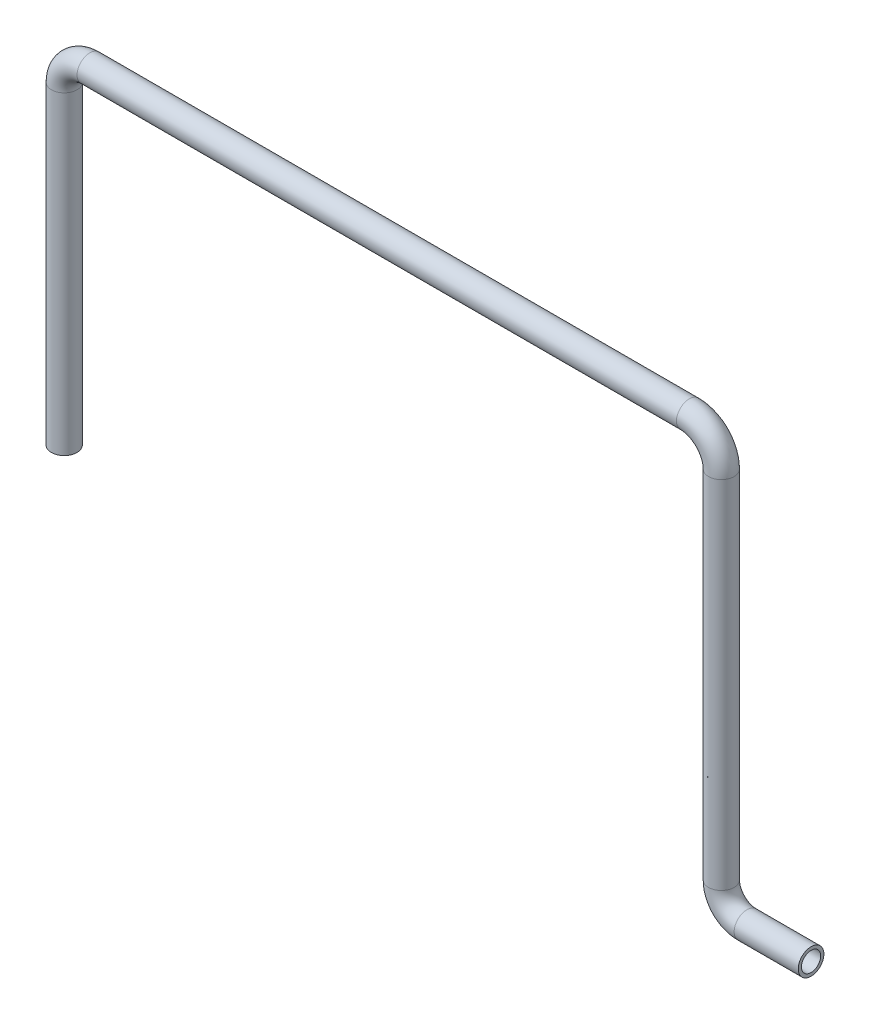
ISO-10303-21;
HEADER;
FILE_DESCRIPTION(('STEP AP214'),'2;1');
FILE_NAME('part.step','',(''),(''),'','','');
FILE_SCHEMA(('AUTOMOTIVE_DESIGN { 1 0 10303 214 1 1 1 1 }'));
ENDSEC;
DATA;
#1=APPLICATION_CONTEXT('core data for automotive mechanical design processes');
#2=APPLICATION_PROTOCOL_DEFINITION('international standard','automotive_design',2000,#1);
#3=PRODUCT_CONTEXT('',#1,'mechanical');
#4=PRODUCT('Part','Part','',(#3));
#5=PRODUCT_RELATED_PRODUCT_CATEGORY('part','',(#4));
#6=PRODUCT_DEFINITION_FORMATION('','',#4);
#7=PRODUCT_DEFINITION_CONTEXT('part definition',#1,'design');
#8=PRODUCT_DEFINITION('design','',#6,#7);
#9=PRODUCT_DEFINITION_SHAPE('','',#8);
#10=(LENGTH_UNIT() NAMED_UNIT(*) SI_UNIT(.MILLI.,.METRE.));
#11=(NAMED_UNIT(*) PLANE_ANGLE_UNIT() SI_UNIT($,.RADIAN.));
#12=(NAMED_UNIT(*) SI_UNIT($,.STERADIAN.) SOLID_ANGLE_UNIT());
#13=UNCERTAINTY_MEASURE_WITH_UNIT(LENGTH_MEASURE(1.E-05),#10,'distance_accuracy_value','');
#14=(GEOMETRIC_REPRESENTATION_CONTEXT(3) GLOBAL_UNCERTAINTY_ASSIGNED_CONTEXT((#13)) GLOBAL_UNIT_ASSIGNED_CONTEXT((#10,
#11,#12)) REPRESENTATION_CONTEXT('',''));
#15=CARTESIAN_POINT('',(0.,0.,0.));
#16=DIRECTION('',(0.,0.,1.));
#17=DIRECTION('',(1.,0.,0.));
#18=AXIS2_PLACEMENT_3D('',#15,#16,#17);
#19=CARTESIAN_POINT('',(-145.,44.,95.));
#20=DIRECTION('',(0.,-1.,0.));
#21=DIRECTION('',(0.,0.,1.));
#22=AXIS2_PLACEMENT_3D('',#19,#20,#21);
#23=PLANE('',#22);
#24=CARTESIAN_POINT('',(-145.,44.,95.));
#25=DIRECTION('',(0.,-1.,0.));
#26=DIRECTION('',(0.,0.,1.));
#27=AXIS2_PLACEMENT_3D('',#24,#25,#26);
#28=CIRCLE('',#27,3.);
#29=CARTESIAN_POINT('',(-145.,44.,98.));
#30=VERTEX_POINT('',#29);
#31=EDGE_CURVE('E263',#30,#30,#28,.T.);
#32=ORIENTED_EDGE('',*,*,#31,.F.);
#33=EDGE_LOOP('',(#32));
#34=FACE_BOUND('',#33,.T.);
#35=CARTESIAN_POINT('',(-145.,44.,95.));
#36=DIRECTION('',(0.,-1.,0.));
#37=DIRECTION('',(0.,0.,-1.));
#38=AXIS2_PLACEMENT_3D('',#35,#36,#37);
#39=CIRCLE('',#38,4.);
#40=CARTESIAN_POINT('',(-145.,44.,91.));
#41=VERTEX_POINT('',#40);
#42=EDGE_CURVE('E75',#41,#41,#39,.T.);
#43=ORIENTED_EDGE('',*,*,#42,.T.);
#44=EDGE_LOOP('',(#43));
#45=FACE_BOUND('',#44,.T.);
#46=ADVANCED_FACE('F52',(#34,#45),#23,.T.);
#47=CARTESIAN_POINT('',(88.,21.,95.));
#48=DIRECTION('',(-1.,0.,0.));
#49=DIRECTION('',(0.,0.,1.));
#50=AXIS2_PLACEMENT_3D('',#47,#48,#49);
#51=PLANE('',#50);
#52=CARTESIAN_POINT('',(88.,21.,95.));
#53=DIRECTION('',(-1.,0.,0.));
#54=DIRECTION('',(0.,0.,1.));
#55=AXIS2_PLACEMENT_3D('',#52,#53,#54);
#56=CIRCLE('',#55,3.);
#57=CARTESIAN_POINT('',(88.,21.,98.));
#58=VERTEX_POINT('',#57);
#59=EDGE_CURVE('E73',#58,#58,#56,.T.);
#60=ORIENTED_EDGE('',*,*,#59,.T.);
#61=EDGE_LOOP('',(#60));
#62=FACE_BOUND('',#61,.T.);
#63=CARTESIAN_POINT('',(88.,21.,95.));
#64=DIRECTION('',(-1.,0.,0.));
#65=DIRECTION('',(0.,0.,1.));
#66=AXIS2_PLACEMENT_3D('',#63,#64,#65);
#67=CIRCLE('',#66,4.);
#68=CARTESIAN_POINT('',(88.,21.,99.));
#69=VERTEX_POINT('',#68);
#70=EDGE_CURVE('E11',#69,#69,#67,.T.);
#71=ORIENTED_EDGE('',*,*,#70,.F.);
#72=EDGE_LOOP('',(#71));
#73=FACE_BOUND('',#72,.T.);
#74=ADVANCED_FACE('F149',(#62,#73),#51,.F.);
#75=CARTESIAN_POINT('',(-145.,44.,95.));
#76=DIRECTION('',(0.,1.,0.));
#77=DIRECTION('',(0.,0.,1.));
#78=AXIS2_PLACEMENT_3D('',#75,#76,#77);
#79=CYLINDRICAL_SURFACE('',#78,4.);
#80=CARTESIAN_POINT('',(-145.,142.,95.));
#81=DIRECTION('',(0.,1.,0.));
#82=DIRECTION('',(0.,0.,1.));
#83=AXIS2_PLACEMENT_3D('',#80,#81,#82);
#84=CIRCLE('',#83,4.);
#85=CARTESIAN_POINT('',(-149.,142.,95.));
#86=VERTEX_POINT('',#85);
#87=EDGE_CURVE('E74',#86,#86,#84,.F.);
#88=ORIENTED_EDGE('',*,*,#87,.T.);
#89=EDGE_LOOP('',(#88));
#90=FACE_BOUND('',#89,.T.);
#91=ORIENTED_EDGE('',*,*,#42,.F.);
#92=EDGE_LOOP('',(#91));
#93=FACE_BOUND('',#92,.T.);
#94=ADVANCED_FACE('F155',(#90,#93),#79,.T.);
#95=CARTESIAN_POINT('',(-137.,142.,95.));
#96=DIRECTION('',(0.,0.,-1.));
#97=DIRECTION('',(-1.,0.,0.));
#98=AXIS2_PLACEMENT_3D('',#95,#96,#97);
#99=TOROIDAL_SURFACE('',#98,8.00000000000001,4.);
#100=CARTESIAN_POINT('',(-137.,150.,95.));
#101=DIRECTION('',(-1.,0.,0.));
#102=DIRECTION('',(0.,-1.,0.));
#103=AXIS2_PLACEMENT_3D('',#100,#101,#102);
#104=CIRCLE('',#103,4.);
#105=CARTESIAN_POINT('',(-137.,154.,95.));
#106=VERTEX_POINT('',#105);
#107=EDGE_CURVE('E78',#106,#106,#104,.T.);
#108=CARTESIAN_POINT('',(-137.,142.,95.));
#109=DIRECTION('',(0.,0.,-1.));
#110=DIRECTION('',(-1.,0.,0.));
#111=AXIS2_PLACEMENT_3D('',#108,#109,#110);
#112=CIRCLE('',#111,12.);
#113=EDGE_CURVE('',#86,#106,#112,.T.);
#114=ORIENTED_EDGE('',*,*,#87,.F.);
#115=ORIENTED_EDGE('',*,*,#107,.T.);
#116=ORIENTED_EDGE('',*,*,#113,.T.);
#117=ORIENTED_EDGE('',*,*,#113,.F.);
#118=EDGE_LOOP('',(#114,#116,#115,#117));
#119=FACE_BOUND('',#118,.T.);
#120=ADVANCED_FACE('F158',(#119),#99,.T.);
#121=CARTESIAN_POINT('',(-137.,150.,95.));
#122=DIRECTION('',(1.,0.,0.));
#123=DIRECTION('',(0.,0.,-1.));
#124=AXIS2_PLACEMENT_3D('',#121,#122,#123);
#125=CYLINDRICAL_SURFACE('',#124,4.);
#126=CARTESIAN_POINT('',(50.,150.,95.));
#127=DIRECTION('',(1.,0.,0.));
#128=DIRECTION('',(0.,0.,-1.));
#129=AXIS2_PLACEMENT_3D('',#126,#127,#128);
#130=CIRCLE('',#129,4.);
#131=CARTESIAN_POINT('',(50.,154.,95.));
#132=VERTEX_POINT('',#131);
#133=EDGE_CURVE('E91',#132,#132,#130,.F.);
#134=ORIENTED_EDGE('',*,*,#133,.T.);
#135=EDGE_LOOP('',(#134));
#136=FACE_BOUND('',#135,.T.);
#137=ORIENTED_EDGE('',*,*,#107,.F.);
#138=EDGE_LOOP('',(#137));
#139=FACE_BOUND('',#138,.T.);
#140=ADVANCED_FACE('F109',(#136,#139),#125,.T.);
#141=CARTESIAN_POINT('',(50.,140.,95.));
#142=DIRECTION('',(0.,0.,-1.));
#143=DIRECTION('',(-1.,0.,0.));
#144=AXIS2_PLACEMENT_3D('',#141,#142,#143);
#145=TOROIDAL_SURFACE('',#144,9.99999999999987,4.);
#146=CARTESIAN_POINT('',(59.9999999999999,140.,95.));
#147=DIRECTION('',(0.,1.,0.));
#148=DIRECTION('',(-1.,0.,0.));
#149=AXIS2_PLACEMENT_3D('',#146,#147,#148);
#150=CIRCLE('',#149,4.);
#151=CARTESIAN_POINT('',(63.9999999999999,140.,95.));
#152=VERTEX_POINT('',#151);
#153=EDGE_CURVE('E68',#152,#152,#150,.T.);
#154=CARTESIAN_POINT('',(50.,140.,95.));
#155=DIRECTION('',(0.,0.,-1.));
#156=DIRECTION('',(-1.,0.,0.));
#157=AXIS2_PLACEMENT_3D('',#154,#155,#156);
#158=CIRCLE('',#157,13.9999999999999);
#159=EDGE_CURVE('',#132,#152,#158,.T.);
#160=ORIENTED_EDGE('',*,*,#133,.F.);
#161=ORIENTED_EDGE('',*,*,#153,.T.);
#162=ORIENTED_EDGE('',*,*,#159,.T.);
#163=ORIENTED_EDGE('',*,*,#159,.F.);
#164=EDGE_LOOP('',(#160,#162,#161,#163));
#165=FACE_BOUND('',#164,.T.);
#166=ADVANCED_FACE('F98',(#165),#145,.T.);
#167=CARTESIAN_POINT('',(60.,140.,95.));
#168=DIRECTION('',(0.,-1.,0.));
#169=DIRECTION('',(1.,0.,0.));
#170=AXIS2_PLACEMENT_3D('',#167,#168,#169);
#171=CYLINDRICAL_SURFACE('',#170,4.);
#172=CARTESIAN_POINT('',(60.,29.,95.));
#173=DIRECTION('',(0.,-1.,0.));
#174=DIRECTION('',(1.,0.,0.));
#175=AXIS2_PLACEMENT_3D('',#172,#173,#174);
#176=CIRCLE('',#175,4.);
#177=CARTESIAN_POINT('',(56.,29.,95.));
#178=VERTEX_POINT('',#177);
#179=EDGE_CURVE('E63',#178,#178,#176,.F.);
#180=ORIENTED_EDGE('',*,*,#179,.T.);
#181=EDGE_LOOP('',(#180));
#182=FACE_BOUND('',#181,.T.);
#183=ORIENTED_EDGE('',*,*,#153,.F.);
#184=EDGE_LOOP('',(#183));
#185=FACE_BOUND('',#184,.T.);
#186=ADVANCED_FACE('F101',(#182,#185),#171,.T.);
#187=CARTESIAN_POINT('',(68.,29.,95.));
#188=DIRECTION('',(0.,0.,1.));
#189=DIRECTION('',(1.,0.,0.));
#190=AXIS2_PLACEMENT_3D('',#187,#188,#189);
#191=TOROIDAL_SURFACE('',#190,7.99999999999999,4.);
#192=CARTESIAN_POINT('',(68.,21.,95.));
#193=DIRECTION('',(-1.,0.,0.));
#194=DIRECTION('',(0.,-1.,0.));
#195=AXIS2_PLACEMENT_3D('',#192,#193,#194);
#196=CIRCLE('',#195,4.);
#197=CARTESIAN_POINT('',(68.0000000000001,17.,95.));
#198=VERTEX_POINT('',#197);
#199=EDGE_CURVE('E58',#198,#198,#196,.T.);
#200=CARTESIAN_POINT('',(68.,29.,95.));
#201=DIRECTION('',(0.,0.,1.));
#202=DIRECTION('',(1.,0.,0.));
#203=AXIS2_PLACEMENT_3D('',#200,#201,#202);
#204=CIRCLE('',#203,12.);
#205=EDGE_CURVE('',#178,#198,#204,.T.);
#206=ORIENTED_EDGE('',*,*,#179,.F.);
#207=ORIENTED_EDGE('',*,*,#199,.T.);
#208=ORIENTED_EDGE('',*,*,#205,.T.);
#209=ORIENTED_EDGE('',*,*,#205,.F.);
#210=EDGE_LOOP('',(#206,#208,#207,#209));
#211=FACE_BOUND('',#210,.T.);
#212=ADVANCED_FACE('F103',(#211),#191,.T.);
#213=CARTESIAN_POINT('',(68.,21.,95.));
#214=DIRECTION('',(1.,0.,0.));
#215=DIRECTION('',(0.,0.,-1.));
#216=AXIS2_PLACEMENT_3D('',#213,#214,#215);
#217=CYLINDRICAL_SURFACE('',#216,4.);
#218=ORIENTED_EDGE('',*,*,#70,.T.);
#219=EDGE_LOOP('',(#218));
#220=FACE_BOUND('',#219,.T.);
#221=ORIENTED_EDGE('',*,*,#199,.F.);
#222=EDGE_LOOP('',(#221));
#223=FACE_BOUND('',#222,.T.);
#224=ADVANCED_FACE('F54',(#220,#223),#217,.T.);
#225=CARTESIAN_POINT('',(-145.,44.,95.));
#226=DIRECTION('',(0.,1.,0.));
#227=DIRECTION('',(0.,0.,1.));
#228=AXIS2_PLACEMENT_3D('',#225,#226,#227);
#229=CYLINDRICAL_SURFACE('',#228,3.);
#230=CARTESIAN_POINT('',(-145.,142.,95.));
#231=DIRECTION('',(0.,-1.,0.));
#232=DIRECTION('',(0.,0.,1.));
#233=AXIS2_PLACEMENT_3D('',#230,#231,#232);
#234=CIRCLE('',#233,3.);
#235=CARTESIAN_POINT('',(-148.,142.,95.));
#236=VERTEX_POINT('',#235);
#237=EDGE_CURVE('E262',#236,#236,#234,.T.);
#238=ORIENTED_EDGE('',*,*,#237,.F.);
#239=EDGE_LOOP('',(#238));
#240=FACE_BOUND('',#239,.T.);
#241=ORIENTED_EDGE('',*,*,#31,.T.);
#242=EDGE_LOOP('',(#241));
#243=FACE_BOUND('',#242,.T.);
#244=ADVANCED_FACE('F114',(#240,#243),#229,.F.);
#245=CARTESIAN_POINT('',(-137.,142.,95.));
#246=DIRECTION('',(0.,0.,-1.));
#247=DIRECTION('',(-1.,0.,0.));
#248=AXIS2_PLACEMENT_3D('',#245,#246,#247);
#249=TOROIDAL_SURFACE('',#248,8.00000000000001,3.);
#250=CARTESIAN_POINT('',(-137.,150.,95.));
#251=DIRECTION('',(-1.,0.,0.));
#252=DIRECTION('',(0.,0.,1.));
#253=AXIS2_PLACEMENT_3D('',#250,#251,#252);
#254=CIRCLE('',#253,3.);
#255=CARTESIAN_POINT('',(-137.,153.,95.));
#256=VERTEX_POINT('',#255);
#257=EDGE_CURVE('E270',#256,#256,#254,.T.);
#258=CARTESIAN_POINT('',(-137.,142.,95.));
#259=DIRECTION('',(0.,0.,-1.));
#260=DIRECTION('',(-1.,0.,0.));
#261=AXIS2_PLACEMENT_3D('',#258,#259,#260);
#262=CIRCLE('',#261,11.);
#263=EDGE_CURVE('',#236,#256,#262,.T.);
#264=ORIENTED_EDGE('',*,*,#237,.T.);
#265=ORIENTED_EDGE('',*,*,#257,.F.);
#266=ORIENTED_EDGE('',*,*,#263,.T.);
#267=ORIENTED_EDGE('',*,*,#263,.F.);
#268=EDGE_LOOP('',(#264,#266,#265,#267));
#269=FACE_BOUND('',#268,.T.);
#270=ADVANCED_FACE('F116',(#269),#249,.F.);
#271=CARTESIAN_POINT('',(-137.,150.,95.));
#272=DIRECTION('',(1.,0.,0.));
#273=DIRECTION('',(0.,0.,-1.));
#274=AXIS2_PLACEMENT_3D('',#271,#272,#273);
#275=CYLINDRICAL_SURFACE('',#274,3.);
#276=CARTESIAN_POINT('',(50.,150.,95.));
#277=DIRECTION('',(-1.,0.,0.));
#278=DIRECTION('',(0.,0.,1.));
#279=AXIS2_PLACEMENT_3D('',#276,#277,#278);
#280=CIRCLE('',#279,3.);
#281=CARTESIAN_POINT('',(50.,153.,95.));
#282=VERTEX_POINT('',#281);
#283=EDGE_CURVE('E275',#282,#282,#280,.T.);
#284=ORIENTED_EDGE('',*,*,#283,.F.);
#285=EDGE_LOOP('',(#284));
#286=FACE_BOUND('',#285,.T.);
#287=ORIENTED_EDGE('',*,*,#257,.T.);
#288=EDGE_LOOP('',(#287));
#289=FACE_BOUND('',#288,.T.);
#290=ADVANCED_FACE('F123',(#286,#289),#275,.F.);
#291=CARTESIAN_POINT('',(50.,140.,95.));
#292=DIRECTION('',(0.,0.,-1.));
#293=DIRECTION('',(-1.,0.,0.));
#294=AXIS2_PLACEMENT_3D('',#291,#292,#293);
#295=TOROIDAL_SURFACE('',#294,9.99999999999987,3.);
#296=CARTESIAN_POINT('',(60.,140.,95.));
#297=DIRECTION('',(0.,1.,0.));
#298=DIRECTION('',(0.,0.,1.));
#299=AXIS2_PLACEMENT_3D('',#296,#297,#298);
#300=CIRCLE('',#299,3.);
#301=CARTESIAN_POINT('',(62.9999999999999,140.,95.));
#302=VERTEX_POINT('',#301);
#303=EDGE_CURVE('E274',#302,#302,#300,.T.);
#304=CARTESIAN_POINT('',(50.,140.,95.));
#305=DIRECTION('',(0.,0.,-1.));
#306=DIRECTION('',(-1.,0.,0.));
#307=AXIS2_PLACEMENT_3D('',#304,#305,#306);
#308=CIRCLE('',#307,12.9999999999999);
#309=EDGE_CURVE('',#282,#302,#308,.T.);
#310=ORIENTED_EDGE('',*,*,#283,.T.);
#311=ORIENTED_EDGE('',*,*,#303,.F.);
#312=ORIENTED_EDGE('',*,*,#309,.T.);
#313=ORIENTED_EDGE('',*,*,#309,.F.);
#314=EDGE_LOOP('',(#310,#312,#311,#313));
#315=FACE_BOUND('',#314,.T.);
#316=ADVANCED_FACE('F131',(#315),#295,.F.);
#317=CARTESIAN_POINT('',(60.,140.,95.));
#318=DIRECTION('',(0.,-1.,0.));
#319=DIRECTION('',(1.,0.,0.));
#320=AXIS2_PLACEMENT_3D('',#317,#318,#319);
#321=CYLINDRICAL_SURFACE('',#320,3.);
#322=CARTESIAN_POINT('',(60.,29.,95.));
#323=DIRECTION('',(0.,1.,0.));
#324=DIRECTION('',(0.,0.,1.));
#325=AXIS2_PLACEMENT_3D('',#322,#323,#324);
#326=CIRCLE('',#325,3.);
#327=CARTESIAN_POINT('',(57.,29.,95.));
#328=VERTEX_POINT('',#327);
#329=EDGE_CURVE('E87',#328,#328,#326,.T.);
#330=ORIENTED_EDGE('',*,*,#329,.F.);
#331=EDGE_LOOP('',(#330));
#332=FACE_BOUND('',#331,.T.);
#333=ORIENTED_EDGE('',*,*,#303,.T.);
#334=EDGE_LOOP('',(#333));
#335=FACE_BOUND('',#334,.T.);
#336=ADVANCED_FACE('F136',(#332,#335),#321,.F.);
#337=CARTESIAN_POINT('',(68.,29.,95.));
#338=DIRECTION('',(0.,0.,1.));
#339=DIRECTION('',(1.,0.,0.));
#340=AXIS2_PLACEMENT_3D('',#337,#338,#339);
#341=TOROIDAL_SURFACE('',#340,7.99999999999999,3.);
#342=CARTESIAN_POINT('',(68.,20.9999999999998,95.));
#343=DIRECTION('',(-1.,0.,0.));
#344=DIRECTION('',(0.,0.,1.));
#345=AXIS2_PLACEMENT_3D('',#342,#343,#344);
#346=CIRCLE('',#345,3.);
#347=CARTESIAN_POINT('',(68.0000000000001,18.,95.));
#348=VERTEX_POINT('',#347);
#349=EDGE_CURVE('E85',#348,#348,#346,.T.);
#350=CARTESIAN_POINT('',(68.,29.,95.));
#351=DIRECTION('',(0.,0.,1.));
#352=DIRECTION('',(1.,0.,0.));
#353=AXIS2_PLACEMENT_3D('',#350,#351,#352);
#354=CIRCLE('',#353,11.);
#355=EDGE_CURVE('',#328,#348,#354,.T.);
#356=ORIENTED_EDGE('',*,*,#329,.T.);
#357=ORIENTED_EDGE('',*,*,#349,.F.);
#358=ORIENTED_EDGE('',*,*,#355,.T.);
#359=ORIENTED_EDGE('',*,*,#355,.F.);
#360=EDGE_LOOP('',(#356,#358,#357,#359));
#361=FACE_BOUND('',#360,.T.);
#362=ADVANCED_FACE('F139',(#361),#341,.F.);
#363=CARTESIAN_POINT('',(68.,21.,95.));
#364=DIRECTION('',(1.,0.,0.));
#365=DIRECTION('',(0.,0.,-1.));
#366=AXIS2_PLACEMENT_3D('',#363,#364,#365);
#367=CYLINDRICAL_SURFACE('',#366,3.);
#368=ORIENTED_EDGE('',*,*,#59,.F.);
#369=EDGE_LOOP('',(#368));
#370=FACE_BOUND('',#369,.T.);
#371=ORIENTED_EDGE('',*,*,#349,.T.);
#372=EDGE_LOOP('',(#371));
#373=FACE_BOUND('',#372,.T.);
#374=ADVANCED_FACE('F145',(#370,#373),#367,.F.);
#375=CLOSED_SHELL('',(#46,#74,#94,#120,#140,#166,#186,#212,#224,#244,#270,#290,#316,#336,#362,#374));
#376=MANIFOLD_SOLID_BREP('B2',#375);
#377=ADVANCED_BREP_SHAPE_REPRESENTATION('',(#18,#376),#14);
#378=SHAPE_DEFINITION_REPRESENTATION(#9,#377);
ENDSEC;
END-ISO-10303-21;
